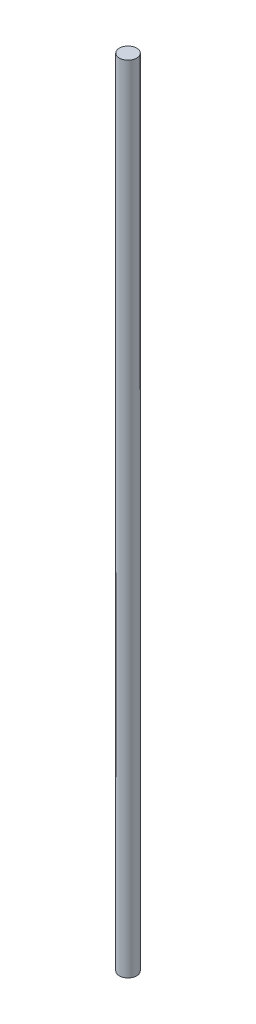
ISO-10303-21;
HEADER;
FILE_DESCRIPTION(('STEP AP214'),'2;1');
FILE_NAME('part.step','',(''),(''),'','','');
FILE_SCHEMA(('AUTOMOTIVE_DESIGN { 1 0 10303 214 1 1 1 1 }'));
ENDSEC;
DATA;
#1=APPLICATION_CONTEXT('core data for automotive mechanical design processes');
#2=APPLICATION_PROTOCOL_DEFINITION('international standard','automotive_design',2000,#1);
#3=PRODUCT_CONTEXT('',#1,'mechanical');
#4=PRODUCT('Part','Part','',(#3));
#5=PRODUCT_RELATED_PRODUCT_CATEGORY('part','',(#4));
#6=PRODUCT_DEFINITION_FORMATION('','',#4);
#7=PRODUCT_DEFINITION_CONTEXT('part definition',#1,'design');
#8=PRODUCT_DEFINITION('design','',#6,#7);
#9=PRODUCT_DEFINITION_SHAPE('','',#8);
#10=(LENGTH_UNIT() NAMED_UNIT(*) SI_UNIT(.MILLI.,.METRE.));
#11=(NAMED_UNIT(*) PLANE_ANGLE_UNIT() SI_UNIT($,.RADIAN.));
#12=(NAMED_UNIT(*) SI_UNIT($,.STERADIAN.) SOLID_ANGLE_UNIT());
#13=UNCERTAINTY_MEASURE_WITH_UNIT(LENGTH_MEASURE(1.E-05),#10,'distance_accuracy_value','');
#14=(GEOMETRIC_REPRESENTATION_CONTEXT(3) GLOBAL_UNCERTAINTY_ASSIGNED_CONTEXT((#13)) GLOBAL_UNIT_ASSIGNED_CONTEXT((#10,
#11,#12)) REPRESENTATION_CONTEXT('',''));
#15=CARTESIAN_POINT('',(0.,0.,0.));
#16=DIRECTION('',(0.,0.,1.));
#17=DIRECTION('',(1.,0.,0.));
#18=AXIS2_PLACEMENT_3D('',#15,#16,#17);
#19=CARTESIAN_POINT('',(0.,458.,0.));
#20=DIRECTION('',(0.,-1.,0.));
#21=DIRECTION('',(0.,0.,-1.));
#22=AXIS2_PLACEMENT_3D('',#19,#20,#21);
#23=CYLINDRICAL_SURFACE('',#22,5.);
#24=CARTESIAN_POINT('',(0.,458.,0.));
#25=DIRECTION('',(0.,1.,0.));
#26=DIRECTION('',(0.,0.,1.));
#27=AXIS2_PLACEMENT_3D('',#24,#25,#26);
#28=CIRCLE('',#27,5.);
#29=CARTESIAN_POINT('',(0.,458.,-5.));
#30=VERTEX_POINT('',#29);
#31=EDGE_CURVE('E10',#30,#30,#28,.T.);
#32=CARTESIAN_POINT('',(0.,0.,0.));
#33=DIRECTION('',(0.,1.,0.));
#34=DIRECTION('',(0.,0.,1.));
#35=AXIS2_PLACEMENT_3D('',#32,#33,#34);
#36=CIRCLE('',#35,5.);
#37=CARTESIAN_POINT('',(0.,0.,-5.));
#38=VERTEX_POINT('',#37);
#39=EDGE_CURVE('E34',#38,#38,#36,.T.);
#40=CARTESIAN_POINT('',(0.,458.,-5.));
#41=CARTESIAN_POINT('',(0.,453.229166666667,-5.));
#42=CARTESIAN_POINT('',(0.,448.458333333333,-5.));
#43=CARTESIAN_POINT('',(0.,438.916666666667,-5.));
#44=CARTESIAN_POINT('',(0.,434.145833333333,-5.));
#45=CARTESIAN_POINT('',(0.,424.604166666667,-5.));
#46=CARTESIAN_POINT('',(0.,419.833333333333,-5.));
#47=CARTESIAN_POINT('',(0.,410.291666666667,-5.));
#48=CARTESIAN_POINT('',(0.,405.520833333333,-5.));
#49=CARTESIAN_POINT('',(0.,395.979166666667,-5.));
#50=CARTESIAN_POINT('',(0.,391.208333333333,-5.));
#51=CARTESIAN_POINT('',(0.,381.666666666667,-5.));
#52=CARTESIAN_POINT('',(0.,376.895833333333,-5.));
#53=CARTESIAN_POINT('',(0.,367.354166666667,-5.));
#54=CARTESIAN_POINT('',(0.,362.583333333333,-5.));
#55=CARTESIAN_POINT('',(0.,353.041666666667,-5.));
#56=CARTESIAN_POINT('',(0.,348.270833333333,-5.));
#57=CARTESIAN_POINT('',(0.,338.729166666667,-5.));
#58=CARTESIAN_POINT('',(0.,333.958333333333,-5.));
#59=CARTESIAN_POINT('',(0.,324.416666666667,-5.));
#60=CARTESIAN_POINT('',(0.,319.645833333333,-5.));
#61=CARTESIAN_POINT('',(0.,310.104166666667,-5.));
#62=CARTESIAN_POINT('',(0.,305.333333333333,-5.));
#63=CARTESIAN_POINT('',(0.,295.791666666667,-5.));
#64=CARTESIAN_POINT('',(0.,291.020833333333,-5.));
#65=CARTESIAN_POINT('',(0.,281.479166666667,-5.));
#66=CARTESIAN_POINT('',(0.,276.708333333333,-5.));
#67=CARTESIAN_POINT('',(0.,267.166666666667,-5.));
#68=CARTESIAN_POINT('',(0.,262.395833333333,-5.));
#69=CARTESIAN_POINT('',(0.,252.854166666667,-5.));
#70=CARTESIAN_POINT('',(0.,248.083333333333,-5.));
#71=CARTESIAN_POINT('',(0.,238.541666666667,-5.));
#72=CARTESIAN_POINT('',(0.,233.770833333333,-5.));
#73=CARTESIAN_POINT('',(0.,224.229166666667,-5.));
#74=CARTESIAN_POINT('',(0.,219.458333333333,-5.));
#75=CARTESIAN_POINT('',(0.,209.916666666667,-5.));
#76=CARTESIAN_POINT('',(0.,205.145833333333,-5.));
#77=CARTESIAN_POINT('',(0.,195.604166666667,-5.));
#78=CARTESIAN_POINT('',(0.,190.833333333333,-5.));
#79=CARTESIAN_POINT('',(0.,181.291666666667,-5.));
#80=CARTESIAN_POINT('',(0.,176.520833333333,-5.));
#81=CARTESIAN_POINT('',(0.,166.979166666667,-5.));
#82=CARTESIAN_POINT('',(0.,162.208333333333,-5.));
#83=CARTESIAN_POINT('',(0.,152.666666666667,-5.));
#84=CARTESIAN_POINT('',(0.,147.895833333333,-5.));
#85=CARTESIAN_POINT('',(0.,138.354166666667,-5.));
#86=CARTESIAN_POINT('',(0.,133.583333333333,-5.));
#87=CARTESIAN_POINT('',(0.,124.041666666667,-5.));
#88=CARTESIAN_POINT('',(0.,119.270833333333,-5.));
#89=CARTESIAN_POINT('',(0.,109.729166666667,-5.));
#90=CARTESIAN_POINT('',(0.,104.958333333333,-5.));
#91=CARTESIAN_POINT('',(0.,95.4166666666667,-5.));
#92=CARTESIAN_POINT('',(0.,90.6458333333334,-5.));
#93=CARTESIAN_POINT('',(0.,81.1041666666667,-5.));
#94=CARTESIAN_POINT('',(0.,76.3333333333334,-5.));
#95=CARTESIAN_POINT('',(0.,66.7916666666667,-5.));
#96=CARTESIAN_POINT('',(0.,62.0208333333334,-5.));
#97=CARTESIAN_POINT('',(0.,52.4791666666667,-5.));
#98=CARTESIAN_POINT('',(0.,47.7083333333333,-5.));
#99=CARTESIAN_POINT('',(0.,38.1666666666667,-5.));
#100=CARTESIAN_POINT('',(0.,33.3958333333333,-5.));
#101=CARTESIAN_POINT('',(0.,23.8541666666667,-5.));
#102=CARTESIAN_POINT('',(0.,19.0833333333333,-5.));
#103=CARTESIAN_POINT('',(0.,9.54166666666667,-5.));
#104=CARTESIAN_POINT('',(0.,4.77083333333334,-5.));
#105=CARTESIAN_POINT('',(0.,0.,-5.));
#106=B_SPLINE_CURVE_WITH_KNOTS('',3,(#40,#41,#42,#43,#44,#45,#46,#47,#48,#49,#50,#51,#52,#53,
#54,#55,#56,#57,#58,#59,#60,#61,#62,#63,#64,#65,#66,#67,#68,#69,#70,#71,#72,#73,#74,#75,#76,#77,
#78,#79,#80,#81,#82,#83,#84,#85,#86,#87,#88,#89,#90,#91,#92,#93,#94,#95,#96,#97,#98,#99,#100,
#101,#102,#103,#104,#105),.UNSPECIFIED.,.F.,.F.,(4,2,2,2,2,2,2,2,2,2,2,2,2,2,2,2,2,2,2,2,2,2,2,
2,2,2,2,2,2,2,2,2,4),(0.,14.3125,28.625,42.9375,57.25,71.5625,85.875,100.1875,114.5,128.8125,
143.125,157.4375,171.75,186.0625,200.375,214.6875,229.,243.3125,257.625,271.9375,286.25,
300.5625,314.875,329.1875,343.5,357.8125,372.125,386.4375,400.75,415.0625,429.375,443.6875,
458.),.UNSPECIFIED.);
#107=EDGE_CURVE('BSEAM31',#30,#38,#106,.T.);
#108=ORIENTED_EDGE('',*,*,#31,.F.);
#109=ORIENTED_EDGE('',*,*,#39,.T.);
#110=ORIENTED_EDGE('',*,*,#107,.T.);
#111=ORIENTED_EDGE('',*,*,#107,.F.);
#112=EDGE_LOOP('',(#108,#110,#109,#111));
#113=FACE_BOUND('',#112,.T.);
#114=ADVANCED_FACE('F31',(#113),#23,.T.);
#115=CARTESIAN_POINT('',(0.,458.,0.));
#116=DIRECTION('',(0.,1.,0.));
#117=DIRECTION('',(0.,0.,1.));
#118=AXIS2_PLACEMENT_3D('',#115,#116,#117);
#119=PLANE('',#118);
#120=ORIENTED_EDGE('',*,*,#31,.T.);
#121=EDGE_LOOP('',(#120));
#122=FACE_BOUND('',#121,.T.);
#123=ADVANCED_FACE('F46',(#122),#119,.T.);
#124=CARTESIAN_POINT('',(0.,0.,0.));
#125=DIRECTION('',(0.,1.,0.));
#126=DIRECTION('',(0.,0.,1.));
#127=AXIS2_PLACEMENT_3D('',#124,#125,#126);
#128=PLANE('',#127);
#129=ORIENTED_EDGE('',*,*,#39,.F.);
#130=EDGE_LOOP('',(#129));
#131=FACE_BOUND('',#130,.T.);
#132=ADVANCED_FACE('F44',(#131),#128,.F.);
#133=CLOSED_SHELL('',(#114,#123,#132));
#134=MANIFOLD_SOLID_BREP('B2',#133);
#135=ADVANCED_BREP_SHAPE_REPRESENTATION('',(#18,#134),#14);
#136=SHAPE_DEFINITION_REPRESENTATION(#9,#135);
ENDSEC;
END-ISO-10303-21;
